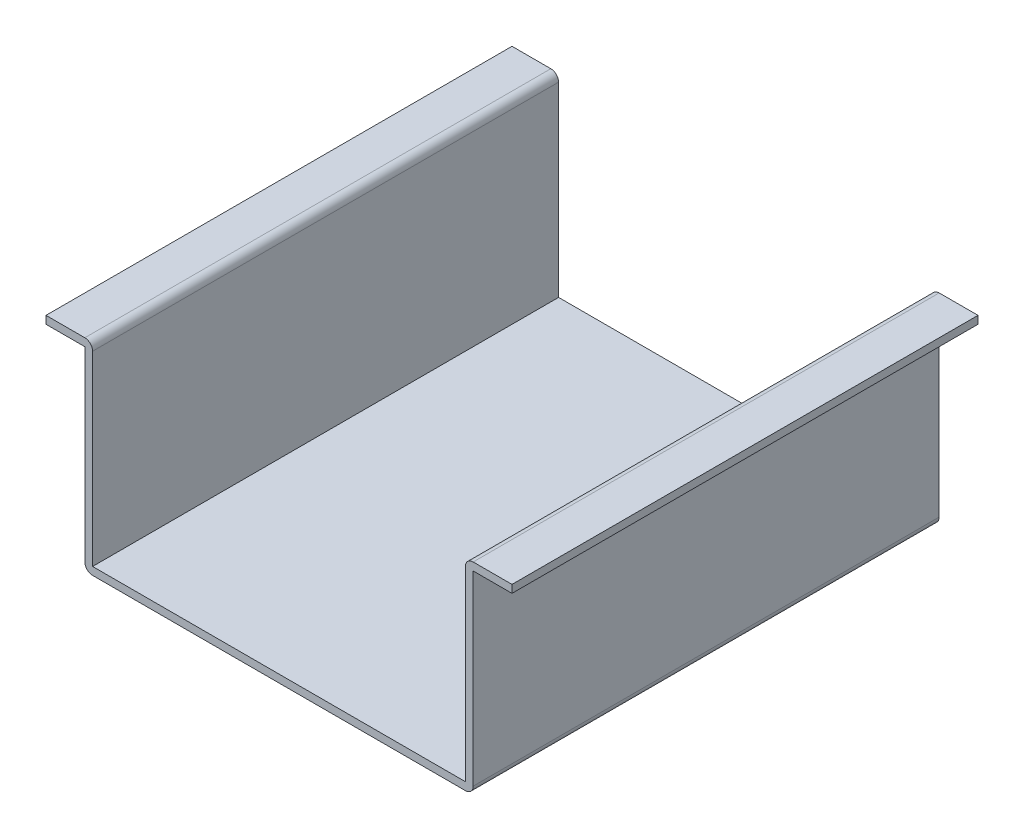
ISO-10303-21;
HEADER;
FILE_DESCRIPTION(('STEP AP214'),'2;1');
FILE_NAME('part.step','',(''),(''),'','','');
FILE_SCHEMA(('AUTOMOTIVE_DESIGN { 1 0 10303 214 1 1 1 1 }'));
ENDSEC;
DATA;
#1=APPLICATION_CONTEXT('core data for automotive mechanical design processes');
#2=APPLICATION_PROTOCOL_DEFINITION('international standard','automotive_design',2000,#1);
#3=PRODUCT_CONTEXT('',#1,'mechanical');
#4=PRODUCT('Part','Part','',(#3));
#5=PRODUCT_RELATED_PRODUCT_CATEGORY('part','',(#4));
#6=PRODUCT_DEFINITION_FORMATION('','',#4);
#7=PRODUCT_DEFINITION_CONTEXT('part definition',#1,'design');
#8=PRODUCT_DEFINITION('design','',#6,#7);
#9=PRODUCT_DEFINITION_SHAPE('','',#8);
#10=(LENGTH_UNIT() NAMED_UNIT(*) SI_UNIT(.MILLI.,.METRE.));
#11=(NAMED_UNIT(*) PLANE_ANGLE_UNIT() SI_UNIT($,.RADIAN.));
#12=(NAMED_UNIT(*) SI_UNIT($,.STERADIAN.) SOLID_ANGLE_UNIT());
#13=UNCERTAINTY_MEASURE_WITH_UNIT(LENGTH_MEASURE(1.E-05),#10,'distance_accuracy_value','');
#14=(GEOMETRIC_REPRESENTATION_CONTEXT(3) GLOBAL_UNCERTAINTY_ASSIGNED_CONTEXT((#13)) GLOBAL_UNIT_ASSIGNED_CONTEXT((#10,
#11,#12)) REPRESENTATION_CONTEXT('',''));
#15=CARTESIAN_POINT('',(0.,0.,0.));
#16=DIRECTION('',(0.,0.,1.));
#17=DIRECTION('',(1.,0.,0.));
#18=AXIS2_PLACEMENT_3D('',#15,#16,#17);
#19=CARTESIAN_POINT('',(0.,52.,0.));
#20=DIRECTION('',(0.,1.,0.));
#21=DIRECTION('',(0.,0.,1.));
#22=AXIS2_PLACEMENT_3D('',#19,#20,#21);
#23=PLANE('',#22);
#24=DIRECTION('',(1.,0.,0.));
#25=VECTOR('',#24,1.);
#26=CARTESIAN_POINT('',(-60.,52.,60.));
#27=LINE('',#26,#25);
#28=CARTESIAN_POINT('',(-60.,52.,60.));
#29=VERTEX_POINT('',#28);
#30=CARTESIAN_POINT('',(-50.,52.,60.));
#31=VERTEX_POINT('',#30);
#32=EDGE_CURVE('E175',#29,#31,#27,.T.);
#33=ORIENTED_EDGE('',*,*,#32,.T.);
#34=DIRECTION('',(0.,0.,-1.));
#35=VECTOR('',#34,1.);
#36=CARTESIAN_POINT('',(-50.,52.,-60.));
#37=LINE('',#36,#35);
#38=CARTESIAN_POINT('',(-50.,52.,-60.));
#39=VERTEX_POINT('',#38);
#40=EDGE_CURVE('E216',#31,#39,#37,.T.);
#41=ORIENTED_EDGE('',*,*,#40,.T.);
#42=DIRECTION('',(-1.,0.,0.));
#43=VECTOR('',#42,1.);
#44=CARTESIAN_POINT('',(60.,52.,-60.));
#45=LINE('',#44,#43);
#46=CARTESIAN_POINT('',(-60.,52.,-60.));
#47=VERTEX_POINT('',#46);
#48=EDGE_CURVE('E221',#39,#47,#45,.T.);
#49=ORIENTED_EDGE('',*,*,#48,.T.);
#50=DIRECTION('',(0.,0.,1.));
#51=VECTOR('',#50,1.);
#52=CARTESIAN_POINT('',(-60.,52.,-60.));
#53=LINE('',#52,#51);
#54=EDGE_CURVE('E280',#47,#29,#53,.T.);
#55=ORIENTED_EDGE('',*,*,#54,.T.);
#56=EDGE_LOOP('',(#33,#41,#49,#55));
#57=FACE_BOUND('',#56,.T.);
#58=ADVANCED_FACE('F39',(#57),#23,.T.);
#59=CARTESIAN_POINT('',(-60.,0.,-60.));
#60=DIRECTION('',(-1.,0.,0.));
#61=DIRECTION('',(0.,0.,1.));
#62=AXIS2_PLACEMENT_3D('',#59,#60,#61);
#63=PLANE('',#62);
#64=DIRECTION('',(0.,0.,-1.));
#65=VECTOR('',#64,1.);
#66=CARTESIAN_POINT('',(-60.,50.,60.));
#67=LINE('',#66,#65);
#68=CARTESIAN_POINT('',(-60.,50.,60.));
#69=VERTEX_POINT('',#68);
#70=CARTESIAN_POINT('',(-60.,50.,-60.));
#71=VERTEX_POINT('',#70);
#72=EDGE_CURVE('E156',#69,#71,#67,.T.);
#73=ORIENTED_EDGE('',*,*,#72,.F.);
#74=DIRECTION('',(0.,1.,0.));
#75=VECTOR('',#74,1.);
#76=CARTESIAN_POINT('',(-60.,0.,60.));
#77=LINE('',#76,#75);
#78=EDGE_CURVE('E169',#69,#29,#77,.T.);
#79=ORIENTED_EDGE('',*,*,#78,.T.);
#80=ORIENTED_EDGE('',*,*,#54,.F.);
#81=DIRECTION('',(0.,1.,0.));
#82=VECTOR('',#81,1.);
#83=CARTESIAN_POINT('',(-60.,0.,-60.));
#84=LINE('',#83,#82);
#85=EDGE_CURVE('E171',#71,#47,#84,.T.);
#86=ORIENTED_EDGE('',*,*,#85,.F.);
#87=EDGE_LOOP('',(#73,#79,#80,#86));
#88=FACE_BOUND('',#87,.T.);
#89=ADVANCED_FACE('F167',(#88),#63,.T.);
#90=CARTESIAN_POINT('',(60.,0.,-60.));
#91=DIRECTION('',(0.,0.,-1.));
#92=DIRECTION('',(-1.,0.,0.));
#93=AXIS2_PLACEMENT_3D('',#90,#91,#92);
#94=PLANE('',#93);
#95=DIRECTION('',(0.,-1.,0.));
#96=VECTOR('',#95,1.);
#97=CARTESIAN_POINT('',(48.,52.,-60.));
#98=LINE('',#97,#96);
#99=CARTESIAN_POINT('',(48.,50.,-60.));
#100=VERTEX_POINT('',#99);
#101=CARTESIAN_POINT('',(48.,2.,-60.));
#102=VERTEX_POINT('',#101);
#103=EDGE_CURVE('E249',#100,#102,#98,.T.);
#104=ORIENTED_EDGE('',*,*,#103,.F.);
#105=CARTESIAN_POINT('',(50.,50.,-60.));
#106=DIRECTION('',(0.,0.,-1.));
#107=DIRECTION('',(-1.,0.,0.));
#108=AXIS2_PLACEMENT_3D('',#105,#106,#107);
#109=CIRCLE('',#108,2.);
#110=CARTESIAN_POINT('',(50.,52.,-60.));
#111=VERTEX_POINT('',#110);
#112=EDGE_CURVE('E197',#100,#111,#109,.T.);
#113=ORIENTED_EDGE('',*,*,#112,.T.);
#114=CARTESIAN_POINT('',(60.,52.,-60.));
#115=VERTEX_POINT('',#114);
#116=EDGE_CURVE('E227',#115,#111,#45,.T.);
#117=ORIENTED_EDGE('',*,*,#116,.F.);
#118=DIRECTION('',(0.,1.,0.));
#119=VECTOR('',#118,1.);
#120=CARTESIAN_POINT('',(60.,0.,-60.));
#121=LINE('',#120,#119);
#122=CARTESIAN_POINT('',(60.,50.,-60.));
#123=VERTEX_POINT('',#122);
#124=EDGE_CURVE('E181',#123,#115,#121,.T.);
#125=ORIENTED_EDGE('',*,*,#124,.F.);
#126=DIRECTION('',(-1.,0.,0.));
#127=VECTOR('',#126,1.);
#128=CARTESIAN_POINT('',(60.,50.,-60.));
#129=LINE('',#128,#127);
#130=CARTESIAN_POINT('',(50.,50.,-60.));
#131=VERTEX_POINT('',#130);
#132=EDGE_CURVE('E307',#123,#131,#129,.T.);
#133=ORIENTED_EDGE('',*,*,#132,.T.);
#134=DIRECTION('',(0.,-1.,0.));
#135=VECTOR('',#134,1.);
#136=CARTESIAN_POINT('',(50.,50.,-60.));
#137=LINE('',#136,#135);
#138=CARTESIAN_POINT('',(50.,2.00000000000001,-60.));
#139=VERTEX_POINT('',#138);
#140=EDGE_CURVE('E309',#131,#139,#137,.T.);
#141=ORIENTED_EDGE('',*,*,#140,.T.);
#142=CARTESIAN_POINT('',(48.,2.00000000000001,-60.));
#143=DIRECTION('',(0.,0.,-1.));
#144=DIRECTION('',(-1.,0.,0.));
#145=AXIS2_PLACEMENT_3D('',#142,#143,#144);
#146=CIRCLE('',#145,2.);
#147=CARTESIAN_POINT('',(48.,0.,-60.));
#148=VERTEX_POINT('',#147);
#149=EDGE_CURVE('E191',#139,#148,#146,.T.);
#150=ORIENTED_EDGE('',*,*,#149,.T.);
#151=DIRECTION('',(-1.,0.,0.));
#152=VECTOR('',#151,1.);
#153=CARTESIAN_POINT('',(60.,0.,-60.));
#154=LINE('',#153,#152);
#155=CARTESIAN_POINT('',(-48.,0.,-60.));
#156=VERTEX_POINT('',#155);
#157=EDGE_CURVE('E178',#148,#156,#154,.T.);
#158=ORIENTED_EDGE('',*,*,#157,.T.);
#159=CARTESIAN_POINT('',(-48.,2.00000000000001,-60.));
#160=DIRECTION('',(0.,0.,-1.));
#161=DIRECTION('',(-1.,0.,0.));
#162=AXIS2_PLACEMENT_3D('',#159,#160,#161);
#163=CIRCLE('',#162,2.);
#164=CARTESIAN_POINT('',(-50.,2.00000000000001,-60.));
#165=VERTEX_POINT('',#164);
#166=EDGE_CURVE('E195',#156,#165,#163,.T.);
#167=ORIENTED_EDGE('',*,*,#166,.T.);
#168=DIRECTION('',(0.,-1.,0.));
#169=VECTOR('',#168,1.);
#170=CARTESIAN_POINT('',(-50.,50.,-60.));
#171=LINE('',#170,#169);
#172=CARTESIAN_POINT('',(-50.,50.,-60.));
#173=VERTEX_POINT('',#172);
#174=EDGE_CURVE('E163',#173,#165,#171,.T.);
#175=ORIENTED_EDGE('',*,*,#174,.F.);
#176=DIRECTION('',(1.,0.,0.));
#177=VECTOR('',#176,1.);
#178=CARTESIAN_POINT('',(-60.,50.,-60.));
#179=LINE('',#178,#177);
#180=EDGE_CURVE('E300',#71,#173,#179,.T.);
#181=ORIENTED_EDGE('',*,*,#180,.F.);
#182=ORIENTED_EDGE('',*,*,#85,.T.);
#183=ORIENTED_EDGE('',*,*,#48,.F.);
#184=CARTESIAN_POINT('',(-50.,50.,-60.));
#185=DIRECTION('',(0.,0.,-1.));
#186=DIRECTION('',(-1.,0.,0.));
#187=AXIS2_PLACEMENT_3D('',#184,#185,#186);
#188=CIRCLE('',#187,2.);
#189=CARTESIAN_POINT('',(-48.,50.,-60.));
#190=VERTEX_POINT('',#189);
#191=EDGE_CURVE('E193',#39,#190,#188,.T.);
#192=ORIENTED_EDGE('',*,*,#191,.T.);
#193=DIRECTION('',(0.,1.,0.));
#194=VECTOR('',#193,1.);
#195=CARTESIAN_POINT('',(-48.,2.,-60.));
#196=LINE('',#195,#194);
#197=CARTESIAN_POINT('',(-48.,2.,-60.));
#198=VERTEX_POINT('',#197);
#199=EDGE_CURVE('E264',#198,#190,#196,.T.);
#200=ORIENTED_EDGE('',*,*,#199,.F.);
#201=DIRECTION('',(-1.,0.,0.));
#202=VECTOR('',#201,1.);
#203=CARTESIAN_POINT('',(48.,2.,-60.));
#204=LINE('',#203,#202);
#205=EDGE_CURVE('E268',#102,#198,#204,.T.);
#206=ORIENTED_EDGE('',*,*,#205,.F.);
#207=EDGE_LOOP('',(#104,#113,#117,#125,#133,#141,#150,#158,#167,#175,#181,#182,#183,#192,#200,#206));
#208=FACE_BOUND('',#207,.T.);
#209=ADVANCED_FACE('F225',(#208),#94,.T.);
#210=CARTESIAN_POINT('',(60.,0.,60.));
#211=DIRECTION('',(1.,0.,0.));
#212=DIRECTION('',(0.,0.,-1.));
#213=AXIS2_PLACEMENT_3D('',#210,#211,#212);
#214=PLANE('',#213);
#215=DIRECTION('',(0.,0.,1.));
#216=VECTOR('',#215,1.);
#217=CARTESIAN_POINT('',(60.,50.,-60.));
#218=LINE('',#217,#216);
#219=CARTESIAN_POINT('',(60.,50.,60.));
#220=VERTEX_POINT('',#219);
#221=EDGE_CURVE('E241',#123,#220,#218,.T.);
#222=ORIENTED_EDGE('',*,*,#221,.F.);
#223=ORIENTED_EDGE('',*,*,#124,.T.);
#224=DIRECTION('',(0.,0.,-1.));
#225=VECTOR('',#224,1.);
#226=CARTESIAN_POINT('',(60.,52.,60.));
#227=LINE('',#226,#225);
#228=CARTESIAN_POINT('',(60.,52.,60.));
#229=VERTEX_POINT('',#228);
#230=EDGE_CURVE('E228',#229,#115,#227,.T.);
#231=ORIENTED_EDGE('',*,*,#230,.F.);
#232=DIRECTION('',(0.,1.,0.));
#233=VECTOR('',#232,1.);
#234=CARTESIAN_POINT('',(60.,0.,60.));
#235=LINE('',#234,#233);
#236=EDGE_CURVE('E177',#220,#229,#235,.T.);
#237=ORIENTED_EDGE('',*,*,#236,.F.);
#238=EDGE_LOOP('',(#222,#223,#231,#237));
#239=FACE_BOUND('',#238,.T.);
#240=ADVANCED_FACE('F239',(#239),#214,.T.);
#241=CARTESIAN_POINT('',(-60.,0.,60.));
#242=DIRECTION('',(0.,0.,1.));
#243=DIRECTION('',(1.,0.,0.));
#244=AXIS2_PLACEMENT_3D('',#241,#242,#243);
#245=PLANE('',#244);
#246=CARTESIAN_POINT('',(50.,52.,60.));
#247=VERTEX_POINT('',#246);
#248=EDGE_CURVE('E247',#247,#229,#27,.T.);
#249=ORIENTED_EDGE('',*,*,#248,.F.);
#250=CARTESIAN_POINT('',(50.,50.,60.));
#251=DIRECTION('',(0.,0.,1.));
#252=DIRECTION('',(1.,0.,0.));
#253=AXIS2_PLACEMENT_3D('',#250,#251,#252);
#254=CIRCLE('',#253,2.);
#255=CARTESIAN_POINT('',(48.,50.,60.));
#256=VERTEX_POINT('',#255);
#257=EDGE_CURVE('E206',#247,#256,#254,.T.);
#258=ORIENTED_EDGE('',*,*,#257,.T.);
#259=DIRECTION('',(0.,-1.,0.));
#260=VECTOR('',#259,1.);
#261=CARTESIAN_POINT('',(48.,52.,60.));
#262=LINE('',#261,#260);
#263=CARTESIAN_POINT('',(48.,2.,60.));
#264=VERTEX_POINT('',#263);
#265=EDGE_CURVE('E259',#256,#264,#262,.T.);
#266=ORIENTED_EDGE('',*,*,#265,.T.);
#267=DIRECTION('',(-1.,0.,0.));
#268=VECTOR('',#267,1.);
#269=CARTESIAN_POINT('',(48.,2.,60.));
#270=LINE('',#269,#268);
#271=CARTESIAN_POINT('',(-48.,2.,60.));
#272=VERTEX_POINT('',#271);
#273=EDGE_CURVE('E263',#264,#272,#270,.T.);
#274=ORIENTED_EDGE('',*,*,#273,.T.);
#275=DIRECTION('',(0.,1.,0.));
#276=VECTOR('',#275,1.);
#277=CARTESIAN_POINT('',(-48.,2.,60.));
#278=LINE('',#277,#276);
#279=CARTESIAN_POINT('',(-48.,50.,60.));
#280=VERTEX_POINT('',#279);
#281=EDGE_CURVE('E266',#272,#280,#278,.T.);
#282=ORIENTED_EDGE('',*,*,#281,.T.);
#283=CARTESIAN_POINT('',(-50.,50.,60.));
#284=DIRECTION('',(0.,0.,1.));
#285=DIRECTION('',(1.,0.,0.));
#286=AXIS2_PLACEMENT_3D('',#283,#284,#285);
#287=CIRCLE('',#286,2.);
#288=EDGE_CURVE('E54',#280,#31,#287,.T.);
#289=ORIENTED_EDGE('',*,*,#288,.T.);
#290=ORIENTED_EDGE('',*,*,#32,.F.);
#291=ORIENTED_EDGE('',*,*,#78,.F.);
#292=DIRECTION('',(1.,0.,0.));
#293=VECTOR('',#292,1.);
#294=CARTESIAN_POINT('',(-60.,50.,60.));
#295=LINE('',#294,#293);
#296=CARTESIAN_POINT('',(-50.,50.,60.));
#297=VERTEX_POINT('',#296);
#298=EDGE_CURVE('E152',#69,#297,#295,.T.);
#299=ORIENTED_EDGE('',*,*,#298,.T.);
#300=DIRECTION('',(0.,-1.,0.));
#301=VECTOR('',#300,1.);
#302=CARTESIAN_POINT('',(-50.,50.,60.));
#303=LINE('',#302,#301);
#304=CARTESIAN_POINT('',(-50.,2.00000000000001,60.));
#305=VERTEX_POINT('',#304);
#306=EDGE_CURVE('E162',#297,#305,#303,.T.);
#307=ORIENTED_EDGE('',*,*,#306,.T.);
#308=CARTESIAN_POINT('',(-48.,2.00000000000001,60.));
#309=DIRECTION('',(0.,0.,1.));
#310=DIRECTION('',(1.,0.,0.));
#311=AXIS2_PLACEMENT_3D('',#308,#309,#310);
#312=CIRCLE('',#311,2.);
#313=CARTESIAN_POINT('',(-48.,0.,60.));
#314=VERTEX_POINT('',#313);
#315=EDGE_CURVE('E204',#305,#314,#312,.T.);
#316=ORIENTED_EDGE('',*,*,#315,.T.);
#317=DIRECTION('',(1.,0.,0.));
#318=VECTOR('',#317,1.);
#319=CARTESIAN_POINT('',(-60.,0.,60.));
#320=LINE('',#319,#318);
#321=CARTESIAN_POINT('',(48.,0.,60.));
#322=VERTEX_POINT('',#321);
#323=EDGE_CURVE('E184',#314,#322,#320,.T.);
#324=ORIENTED_EDGE('',*,*,#323,.T.);
#325=CARTESIAN_POINT('',(48.,2.00000000000001,60.));
#326=DIRECTION('',(0.,0.,1.));
#327=DIRECTION('',(1.,0.,0.));
#328=AXIS2_PLACEMENT_3D('',#325,#326,#327);
#329=CIRCLE('',#328,2.);
#330=CARTESIAN_POINT('',(50.,2.00000000000001,60.));
#331=VERTEX_POINT('',#330);
#332=EDGE_CURVE('E201',#322,#331,#329,.T.);
#333=ORIENTED_EDGE('',*,*,#332,.T.);
#334=DIRECTION('',(0.,-1.,0.));
#335=VECTOR('',#334,1.);
#336=CARTESIAN_POINT('',(50.,50.,60.));
#337=LINE('',#336,#335);
#338=CARTESIAN_POINT('',(50.,50.,60.));
#339=VERTEX_POINT('',#338);
#340=EDGE_CURVE('E310',#339,#331,#337,.T.);
#341=ORIENTED_EDGE('',*,*,#340,.F.);
#342=DIRECTION('',(-1.,0.,0.));
#343=VECTOR('',#342,1.);
#344=CARTESIAN_POINT('',(60.,50.,60.));
#345=LINE('',#344,#343);
#346=EDGE_CURVE('E305',#220,#339,#345,.T.);
#347=ORIENTED_EDGE('',*,*,#346,.F.);
#348=ORIENTED_EDGE('',*,*,#236,.T.);
#349=EDGE_LOOP('',(#249,#258,#266,#274,#282,#289,#290,#291,#299,#307,#316,#324,#333,#341,#347,#348));
#350=FACE_BOUND('',#349,.T.);
#351=ADVANCED_FACE('F174',(#350),#245,.T.);
#352=CARTESIAN_POINT('',(0.,0.,0.));
#353=DIRECTION('',(0.,1.,0.));
#354=DIRECTION('',(0.,0.,1.));
#355=AXIS2_PLACEMENT_3D('',#352,#353,#354);
#356=PLANE('',#355);
#357=ORIENTED_EDGE('',*,*,#323,.F.);
#358=DIRECTION('',(0.,0.,-1.));
#359=VECTOR('',#358,1.);
#360=CARTESIAN_POINT('',(-48.,0.,0.));
#361=LINE('',#360,#359);
#362=EDGE_CURVE('E211',#314,#156,#361,.T.);
#363=ORIENTED_EDGE('',*,*,#362,.T.);
#364=ORIENTED_EDGE('',*,*,#157,.F.);
#365=DIRECTION('',(0.,0.,1.));
#366=VECTOR('',#365,1.);
#367=CARTESIAN_POINT('',(48.,0.,0.));
#368=LINE('',#367,#366);
#369=EDGE_CURVE('E208',#148,#322,#368,.T.);
#370=ORIENTED_EDGE('',*,*,#369,.T.);
#371=EDGE_LOOP('',(#357,#363,#364,#370));
#372=FACE_BOUND('',#371,.T.);
#373=ADVANCED_FACE('F290',(#372),#356,.F.);
#374=ORIENTED_EDGE('',*,*,#116,.T.);
#375=DIRECTION('',(0.,0.,-1.));
#376=VECTOR('',#375,1.);
#377=CARTESIAN_POINT('',(50.,52.,60.));
#378=LINE('',#377,#376);
#379=EDGE_CURVE('E199',#111,#247,#378,.F.);
#380=ORIENTED_EDGE('',*,*,#379,.T.);
#381=ORIENTED_EDGE('',*,*,#248,.T.);
#382=ORIENTED_EDGE('',*,*,#230,.T.);
#383=EDGE_LOOP('',(#374,#380,#381,#382));
#384=FACE_BOUND('',#383,.T.);
#385=ADVANCED_FACE('F245',(#384),#23,.T.);
#386=CARTESIAN_POINT('',(-48.,2.,60.));
#387=DIRECTION('',(-1.,0.,0.));
#388=DIRECTION('',(0.,0.,1.));
#389=AXIS2_PLACEMENT_3D('',#386,#387,#388);
#390=PLANE('',#389);
#391=ORIENTED_EDGE('',*,*,#199,.T.);
#392=DIRECTION('',(0.,0.,-1.));
#393=VECTOR('',#392,1.);
#394=CARTESIAN_POINT('',(-48.,50.,60.));
#395=LINE('',#394,#393);
#396=EDGE_CURVE('E47',#190,#280,#395,.F.);
#397=ORIENTED_EDGE('',*,*,#396,.T.);
#398=ORIENTED_EDGE('',*,*,#281,.F.);
#399=DIRECTION('',(0.,0.,-1.));
#400=VECTOR('',#399,1.);
#401=CARTESIAN_POINT('',(-48.,2.,60.));
#402=LINE('',#401,#400);
#403=EDGE_CURVE('E278',#272,#198,#402,.T.);
#404=ORIENTED_EDGE('',*,*,#403,.T.);
#405=EDGE_LOOP('',(#391,#397,#398,#404));
#406=FACE_BOUND('',#405,.T.);
#407=ADVANCED_FACE('F338',(#406),#390,.F.);
#408=CARTESIAN_POINT('',(48.,2.,60.));
#409=DIRECTION('',(0.,-1.,0.));
#410=DIRECTION('',(0.,0.,-1.));
#411=AXIS2_PLACEMENT_3D('',#408,#409,#410);
#412=PLANE('',#411);
#413=ORIENTED_EDGE('',*,*,#205,.T.);
#414=ORIENTED_EDGE('',*,*,#403,.F.);
#415=ORIENTED_EDGE('',*,*,#273,.F.);
#416=DIRECTION('',(0.,0.,-1.));
#417=VECTOR('',#416,1.);
#418=CARTESIAN_POINT('',(48.,2.,60.));
#419=LINE('',#418,#417);
#420=EDGE_CURVE('E260',#264,#102,#419,.T.);
#421=ORIENTED_EDGE('',*,*,#420,.T.);
#422=EDGE_LOOP('',(#413,#414,#415,#421));
#423=FACE_BOUND('',#422,.T.);
#424=ADVANCED_FACE('F343',(#423),#412,.F.);
#425=CARTESIAN_POINT('',(48.,52.,60.));
#426=DIRECTION('',(1.,0.,0.));
#427=DIRECTION('',(0.,0.,-1.));
#428=AXIS2_PLACEMENT_3D('',#425,#426,#427);
#429=PLANE('',#428);
#430=ORIENTED_EDGE('',*,*,#265,.F.);
#431=DIRECTION('',(0.,0.,-1.));
#432=VECTOR('',#431,1.);
#433=CARTESIAN_POINT('',(48.,50.,-60.));
#434=LINE('',#433,#432);
#435=EDGE_CURVE('E188',#256,#100,#434,.T.);
#436=ORIENTED_EDGE('',*,*,#435,.T.);
#437=ORIENTED_EDGE('',*,*,#103,.T.);
#438=ORIENTED_EDGE('',*,*,#420,.F.);
#439=EDGE_LOOP('',(#430,#436,#437,#438));
#440=FACE_BOUND('',#439,.T.);
#441=ADVANCED_FACE('F256',(#440),#429,.F.);
#442=CARTESIAN_POINT('',(50.,50.,-60.));
#443=DIRECTION('',(-1.,0.,0.));
#444=DIRECTION('',(0.,0.,1.));
#445=AXIS2_PLACEMENT_3D('',#442,#443,#444);
#446=PLANE('',#445);
#447=ORIENTED_EDGE('',*,*,#340,.T.);
#448=DIRECTION('',(0.,0.,1.));
#449=VECTOR('',#448,1.);
#450=CARTESIAN_POINT('',(50.,2.00000000000001,-60.));
#451=LINE('',#450,#449);
#452=EDGE_CURVE('E11',#331,#139,#451,.F.);
#453=ORIENTED_EDGE('',*,*,#452,.T.);
#454=ORIENTED_EDGE('',*,*,#140,.F.);
#455=DIRECTION('',(0.,0.,1.));
#456=VECTOR('',#455,1.);
#457=CARTESIAN_POINT('',(50.,50.,-60.));
#458=LINE('',#457,#456);
#459=EDGE_CURVE('E275',#131,#339,#458,.T.);
#460=ORIENTED_EDGE('',*,*,#459,.T.);
#461=EDGE_LOOP('',(#447,#453,#454,#460));
#462=FACE_BOUND('',#461,.T.);
#463=ADVANCED_FACE('F321',(#462),#446,.F.);
#464=CARTESIAN_POINT('',(60.,50.,-60.));
#465=DIRECTION('',(0.,1.,0.));
#466=DIRECTION('',(0.,0.,1.));
#467=AXIS2_PLACEMENT_3D('',#464,#465,#466);
#468=PLANE('',#467);
#469=ORIENTED_EDGE('',*,*,#346,.T.);
#470=ORIENTED_EDGE('',*,*,#459,.F.);
#471=ORIENTED_EDGE('',*,*,#132,.F.);
#472=ORIENTED_EDGE('',*,*,#221,.T.);
#473=EDGE_LOOP('',(#469,#470,#471,#472));
#474=FACE_BOUND('',#473,.T.);
#475=ADVANCED_FACE('F319',(#474),#468,.F.);
#476=CARTESIAN_POINT('',(-50.,50.,60.));
#477=DIRECTION('',(1.,0.,0.));
#478=DIRECTION('',(0.,0.,-1.));
#479=AXIS2_PLACEMENT_3D('',#476,#477,#478);
#480=PLANE('',#479);
#481=ORIENTED_EDGE('',*,*,#174,.T.);
#482=DIRECTION('',(0.,0.,-1.));
#483=VECTOR('',#482,1.);
#484=CARTESIAN_POINT('',(-50.,2.00000000000001,60.));
#485=LINE('',#484,#483);
#486=EDGE_CURVE('E214',#165,#305,#485,.F.);
#487=ORIENTED_EDGE('',*,*,#486,.T.);
#488=ORIENTED_EDGE('',*,*,#306,.F.);
#489=DIRECTION('',(0.,0.,-1.));
#490=VECTOR('',#489,1.);
#491=CARTESIAN_POINT('',(-50.,50.,60.));
#492=LINE('',#491,#490);
#493=EDGE_CURVE('E158',#297,#173,#492,.T.);
#494=ORIENTED_EDGE('',*,*,#493,.T.);
#495=EDGE_LOOP('',(#481,#487,#488,#494));
#496=FACE_BOUND('',#495,.T.);
#497=ADVANCED_FACE('F299',(#496),#480,.F.);
#498=CARTESIAN_POINT('',(-60.,50.,60.));
#499=DIRECTION('',(0.,1.,0.));
#500=DIRECTION('',(0.,0.,1.));
#501=AXIS2_PLACEMENT_3D('',#498,#499,#500);
#502=PLANE('',#501);
#503=ORIENTED_EDGE('',*,*,#180,.T.);
#504=ORIENTED_EDGE('',*,*,#493,.F.);
#505=ORIENTED_EDGE('',*,*,#298,.F.);
#506=ORIENTED_EDGE('',*,*,#72,.T.);
#507=EDGE_LOOP('',(#503,#504,#505,#506));
#508=FACE_BOUND('',#507,.T.);
#509=ADVANCED_FACE('F155',(#508),#502,.F.);
#510=CARTESIAN_POINT('',(50.,50.,60.));
#511=DIRECTION('',(0.,0.,1.));
#512=DIRECTION('',(1.,0.,0.));
#513=AXIS2_PLACEMENT_3D('',#510,#511,#512);
#514=CYLINDRICAL_SURFACE('',#513,2.);
#515=ORIENTED_EDGE('',*,*,#257,.F.);
#516=ORIENTED_EDGE('',*,*,#379,.F.);
#517=ORIENTED_EDGE('',*,*,#112,.F.);
#518=ORIENTED_EDGE('',*,*,#435,.F.);
#519=EDGE_LOOP('',(#515,#516,#517,#518));
#520=FACE_BOUND('',#519,.T.);
#521=ADVANCED_FACE('F253',(#520),#514,.T.);
#522=CARTESIAN_POINT('',(-48.,2.00000000000001,0.));
#523=DIRECTION('',(0.,0.,-1.));
#524=DIRECTION('',(-1.,0.,0.));
#525=AXIS2_PLACEMENT_3D('',#522,#523,#524);
#526=CYLINDRICAL_SURFACE('',#525,2.);
#527=ORIENTED_EDGE('',*,*,#315,.F.);
#528=ORIENTED_EDGE('',*,*,#486,.F.);
#529=ORIENTED_EDGE('',*,*,#166,.F.);
#530=ORIENTED_EDGE('',*,*,#362,.F.);
#531=EDGE_LOOP('',(#527,#528,#529,#530));
#532=FACE_BOUND('',#531,.T.);
#533=ADVANCED_FACE('F294',(#532),#526,.T.);
#534=CARTESIAN_POINT('',(-50.,50.,0.));
#535=DIRECTION('',(0.,0.,1.));
#536=DIRECTION('',(1.,0.,0.));
#537=AXIS2_PLACEMENT_3D('',#534,#535,#536);
#538=CYLINDRICAL_SURFACE('',#537,2.);
#539=ORIENTED_EDGE('',*,*,#288,.F.);
#540=ORIENTED_EDGE('',*,*,#396,.F.);
#541=ORIENTED_EDGE('',*,*,#191,.F.);
#542=ORIENTED_EDGE('',*,*,#40,.F.);
#543=EDGE_LOOP('',(#539,#540,#541,#542));
#544=FACE_BOUND('',#543,.T.);
#545=ADVANCED_FACE('F325',(#544),#538,.T.);
#546=CARTESIAN_POINT('',(48.,2.00000000000001,0.));
#547=DIRECTION('',(0.,0.,1.));
#548=DIRECTION('',(1.,0.,0.));
#549=AXIS2_PLACEMENT_3D('',#546,#547,#548);
#550=CYLINDRICAL_SURFACE('',#549,2.);
#551=ORIENTED_EDGE('',*,*,#149,.F.);
#552=ORIENTED_EDGE('',*,*,#452,.F.);
#553=ORIENTED_EDGE('',*,*,#332,.F.);
#554=ORIENTED_EDGE('',*,*,#369,.F.);
#555=EDGE_LOOP('',(#551,#552,#553,#554));
#556=FACE_BOUND('',#555,.T.);
#557=ADVANCED_FACE('F41',(#556),#550,.T.);
#558=CLOSED_SHELL('',(#58,#89,#209,#240,#351,#373,#385,#407,#424,#441,#463,#475,#497,#509,#521,
#533,#545,#557));
#559=MANIFOLD_SOLID_BREP('B2',#558);
#560=ADVANCED_BREP_SHAPE_REPRESENTATION('',(#18,#559),#14);
#561=SHAPE_DEFINITION_REPRESENTATION(#9,#560);
ENDSEC;
END-ISO-10303-21;
